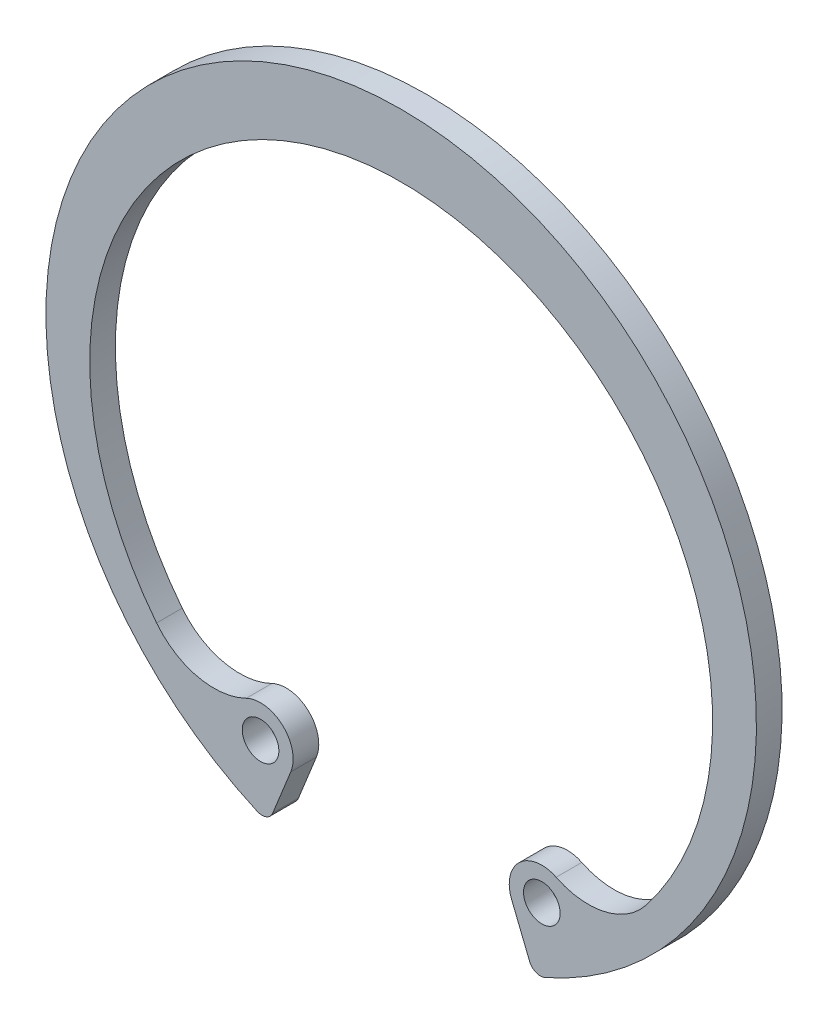
ISO-10303-21;
HEADER;
FILE_DESCRIPTION(('STEP AP214'),'2;1');
FILE_NAME('part.step','',(''),(''),'','','');
FILE_SCHEMA(('AUTOMOTIVE_DESIGN { 1 0 10303 214 1 1 1 1 }'));
ENDSEC;
DATA;
#1=APPLICATION_CONTEXT('core data for automotive mechanical design processes');
#2=APPLICATION_PROTOCOL_DEFINITION('international standard','automotive_design',2000,#1);
#3=PRODUCT_CONTEXT('',#1,'mechanical');
#4=PRODUCT('Part','Part','',(#3));
#5=PRODUCT_RELATED_PRODUCT_CATEGORY('part','',(#4));
#6=PRODUCT_DEFINITION_FORMATION('','',#4);
#7=PRODUCT_DEFINITION_CONTEXT('part definition',#1,'design');
#8=PRODUCT_DEFINITION('design','',#6,#7);
#9=PRODUCT_DEFINITION_SHAPE('','',#8);
#10=(LENGTH_UNIT() NAMED_UNIT(*) SI_UNIT(.MILLI.,.METRE.));
#11=(NAMED_UNIT(*) PLANE_ANGLE_UNIT() SI_UNIT($,.RADIAN.));
#12=(NAMED_UNIT(*) SI_UNIT($,.STERADIAN.) SOLID_ANGLE_UNIT());
#13=UNCERTAINTY_MEASURE_WITH_UNIT(LENGTH_MEASURE(1.E-05),#10,'distance_accuracy_value','');
#14=(GEOMETRIC_REPRESENTATION_CONTEXT(3) GLOBAL_UNCERTAINTY_ASSIGNED_CONTEXT((#13)) GLOBAL_UNIT_ASSIGNED_CONTEXT((#10,
#11,#12)) REPRESENTATION_CONTEXT('',''));
#15=CARTESIAN_POINT('',(0.,0.,0.));
#16=DIRECTION('',(0.,0.,1.));
#17=DIRECTION('',(1.,0.,0.));
#18=AXIS2_PLACEMENT_3D('',#15,#16,#17);
#19=CARTESIAN_POINT('',(0.,0.,-0.874999999999999));
#20=DIRECTION('',(0.,0.,1.));
#21=DIRECTION('',(1.,0.,0.));
#22=AXIS2_PLACEMENT_3D('',#19,#20,#21);
#23=CYLINDRICAL_SURFACE('',#22,24.25);
#24=CARTESIAN_POINT('',(0.,0.,0.875000000000001));
#25=DIRECTION('',(0.,0.,1.));
#26=DIRECTION('',(-1.,0.,0.));
#27=AXIS2_PLACEMENT_3D('',#24,#25,#26);
#28=CIRCLE('',#27,24.25);
#29=CARTESIAN_POINT('',(9.82443604998998,-22.1707680584065,0.875000000000001));
#30=VERTEX_POINT('',#29);
#31=CARTESIAN_POINT('',(-9.82443604998999,-22.1707680584065,0.875000000000001));
#32=VERTEX_POINT('',#31);
#33=EDGE_CURVE('E132',#30,#32,#28,.T.);
#34=ORIENTED_EDGE('',*,*,#33,.F.);
#35=DIRECTION('',(0.,0.,1.));
#36=VECTOR('',#35,1.);
#37=CARTESIAN_POINT('',(9.82443604998999,-22.1707680584065,-0.874999999999999));
#38=LINE('',#37,#36);
#39=CARTESIAN_POINT('',(9.82443604998998,-22.1707680584065,-0.874999999999999));
#40=VERTEX_POINT('',#39);
#41=EDGE_CURVE('E231',#30,#40,#38,.F.);
#42=ORIENTED_EDGE('',*,*,#41,.T.);
#43=CARTESIAN_POINT('',(0.,0.,-0.874999999999999));
#44=DIRECTION('',(0.,0.,1.));
#45=DIRECTION('',(-1.,0.,0.));
#46=AXIS2_PLACEMENT_3D('',#43,#44,#45);
#47=CIRCLE('',#46,24.25);
#48=CARTESIAN_POINT('',(-9.82443604998999,-22.1707680584065,-0.874999999999999));
#49=VERTEX_POINT('',#48);
#50=EDGE_CURVE('E177',#40,#49,#47,.T.);
#51=ORIENTED_EDGE('',*,*,#50,.T.);
#52=DIRECTION('',(0.,0.,1.));
#53=VECTOR('',#52,1.);
#54=CARTESIAN_POINT('',(-9.82443604998999,-22.1707680584065,-0.874999999999999));
#55=LINE('',#54,#53);
#56=EDGE_CURVE('E227',#49,#32,#55,.T.);
#57=ORIENTED_EDGE('',*,*,#56,.T.);
#58=EDGE_LOOP('',(#34,#42,#51,#57));
#59=FACE_BOUND('',#58,.T.);
#60=ADVANCED_FACE('F43',(#59),#23,.T.);
#61=CARTESIAN_POINT('',(7.53626964159346,-18.690362219315,-0.874999999999999));
#62=DIRECTION('',(-0.927444341621787,-0.373961218836565,0.));
#63=DIRECTION('',(0.373961218836565,-0.927444341621787,0.));
#64=AXIS2_PLACEMENT_3D('',#61,#62,#63);
#65=PLANE('',#64);
#66=DIRECTION('',(0.373961218836565,-0.927444341621787,0.));
#67=VECTOR('',#66,1.);
#68=CARTESIAN_POINT('',(7.53626964159346,-18.690362219315,-0.874999999999999));
#69=LINE('',#68,#67);
#70=CARTESIAN_POINT('',(7.53626964159346,-18.690362219315,-0.874999999999999));
#71=VERTEX_POINT('',#70);
#72=CARTESIAN_POINT('',(8.7667040681708,-21.7419071100287,-0.874999999999999));
#73=VERTEX_POINT('',#72);
#74=EDGE_CURVE('E143',#71,#73,#69,.T.);
#75=ORIENTED_EDGE('',*,*,#74,.T.);
#76=DIRECTION('',(0.,0.,1.));
#77=VECTOR('',#76,1.);
#78=CARTESIAN_POINT('',(8.7667040681708,-21.7419071100287,-0.874999999999999));
#79=LINE('',#78,#77);
#80=CARTESIAN_POINT('',(8.7667040681708,-21.7419071100287,0.875000000000001));
#81=VERTEX_POINT('',#80);
#82=EDGE_CURVE('E207',#73,#81,#79,.T.);
#83=ORIENTED_EDGE('',*,*,#82,.T.);
#84=DIRECTION('',(0.373961218836565,-0.927444341621787,0.));
#85=VECTOR('',#84,1.);
#86=CARTESIAN_POINT('',(7.53626964159346,-18.690362219315,0.875000000000001));
#87=LINE('',#86,#85);
#88=CARTESIAN_POINT('',(7.53626964159346,-18.690362219315,0.875000000000001));
#89=VERTEX_POINT('',#88);
#90=EDGE_CURVE('E166',#89,#81,#87,.T.);
#91=ORIENTED_EDGE('',*,*,#90,.F.);
#92=DIRECTION('',(0.,0.,1.));
#93=VECTOR('',#92,1.);
#94=CARTESIAN_POINT('',(7.53626964159346,-18.690362219315,-0.874999999999999));
#95=LINE('',#94,#93);
#96=EDGE_CURVE('E204',#71,#89,#95,.T.);
#97=ORIENTED_EDGE('',*,*,#96,.F.);
#98=EDGE_LOOP('',(#75,#83,#91,#97));
#99=FACE_BOUND('',#98,.T.);
#100=ADVANCED_FACE('F245',(#99),#65,.T.);
#101=CARTESIAN_POINT('',(9.59983330170194,-17.8582985074036,-0.874999999999999));
#102=DIRECTION('',(0.,0.,1.));
#103=DIRECTION('',(1.,0.,0.));
#104=AXIS2_PLACEMENT_3D('',#101,#102,#103);
#105=CYLINDRICAL_SURFACE('',#104,2.225);
#106=ORIENTED_EDGE('',*,*,#96,.T.);
#107=CARTESIAN_POINT('',(9.59983330170194,-17.8582985074036,0.875000000000001));
#108=DIRECTION('',(0.,0.,1.));
#109=DIRECTION('',(1.,0.,0.));
#110=AXIS2_PLACEMENT_3D('',#107,#108,#109);
#111=CIRCLE('',#110,2.225);
#112=CARTESIAN_POINT('',(10.5790722598928,-15.860370565069,0.875000000000001));
#113=VERTEX_POINT('',#112);
#114=EDGE_CURVE('E162',#113,#89,#111,.T.);
#115=ORIENTED_EDGE('',*,*,#114,.F.);
#116=DIRECTION('',(0.,0.,1.));
#117=VECTOR('',#116,1.);
#118=CARTESIAN_POINT('',(10.5790722598928,-15.860370565069,-0.874999999999999));
#119=LINE('',#118,#117);
#120=CARTESIAN_POINT('',(10.5790722598928,-15.860370565069,-0.874999999999999));
#121=VERTEX_POINT('',#120);
#122=EDGE_CURVE('E208',#121,#113,#119,.T.);
#123=ORIENTED_EDGE('',*,*,#122,.F.);
#124=CARTESIAN_POINT('',(9.59983330170194,-17.8582985074036,-0.874999999999999));
#125=DIRECTION('',(0.,0.,1.));
#126=DIRECTION('',(1.,0.,0.));
#127=AXIS2_PLACEMENT_3D('',#124,#125,#126);
#128=CIRCLE('',#127,2.225);
#129=EDGE_CURVE('E197',#121,#71,#128,.T.);
#130=ORIENTED_EDGE('',*,*,#129,.T.);
#131=EDGE_LOOP('',(#106,#115,#123,#130));
#132=FACE_BOUND('',#131,.T.);
#133=ADVANCED_FACE('F280',(#132),#105,.T.);
#134=CARTESIAN_POINT('',(12.7760927844927,-11.377819437722,-0.874999999999999));
#135=DIRECTION('',(0.,0.,1.));
#136=DIRECTION('',(1.,0.,0.));
#137=AXIS2_PLACEMENT_3D('',#134,#135,#136);
#138=CYLINDRICAL_SURFACE('',#137,4.99200999546205);
#139=ORIENTED_EDGE('',*,*,#122,.T.);
#140=CARTESIAN_POINT('',(12.7760927844927,-11.377819437722,0.875000000000001));
#141=DIRECTION('',(0.,0.,-1.));
#142=DIRECTION('',(-1.,0.,0.));
#143=AXIS2_PLACEMENT_3D('',#140,#141,#142);
#144=CIRCLE('',#143,4.99200999546205);
#145=CARTESIAN_POINT('',(16.6968412939928,-14.4677862530852,0.875000000000001));
#146=VERTEX_POINT('',#145);
#147=EDGE_CURVE('E158',#146,#113,#144,.T.);
#148=ORIENTED_EDGE('',*,*,#147,.F.);
#149=DIRECTION('',(0.,0.,1.));
#150=VECTOR('',#149,1.);
#151=CARTESIAN_POINT('',(16.6968412939928,-14.4677862530852,-0.874999999999999));
#152=LINE('',#151,#150);
#153=CARTESIAN_POINT('',(16.6968412939928,-14.4677862530852,-0.874999999999999));
#154=VERTEX_POINT('',#153);
#155=EDGE_CURVE('E211',#154,#146,#152,.T.);
#156=ORIENTED_EDGE('',*,*,#155,.F.);
#157=CARTESIAN_POINT('',(12.7760927844927,-11.377819437722,-0.874999999999999));
#158=DIRECTION('',(0.,0.,-1.));
#159=DIRECTION('',(-1.,0.,0.));
#160=AXIS2_PLACEMENT_3D('',#157,#158,#159);
#161=CIRCLE('',#160,4.99200999546205);
#162=EDGE_CURVE('E193',#154,#121,#161,.T.);
#163=ORIENTED_EDGE('',*,*,#162,.T.);
#164=EDGE_LOOP('',(#139,#148,#156,#163));
#165=FACE_BOUND('',#164,.T.);
#166=ADVANCED_FACE('F294',(#165),#138,.F.);
#167=CARTESIAN_POINT('',(0.,-1.30889952652993,-0.874999999999999));
#168=DIRECTION('',(0.,0.,1.));
#169=DIRECTION('',(1.,0.,0.));
#170=AXIS2_PLACEMENT_3D('',#167,#168,#169);
#171=CYLINDRICAL_SURFACE('',#170,21.2588995265299);
#172=ORIENTED_EDGE('',*,*,#155,.T.);
#173=CARTESIAN_POINT('',(0.,-1.30889952652993,0.875000000000001));
#174=DIRECTION('',(0.,0.,-1.));
#175=DIRECTION('',(-1.,0.,0.));
#176=AXIS2_PLACEMENT_3D('',#173,#174,#175);
#177=CIRCLE('',#176,21.2588995265299);
#178=CARTESIAN_POINT('',(-16.6968412939928,-14.4677862530852,0.875000000000001));
#179=VERTEX_POINT('',#178);
#180=EDGE_CURVE('E151',#179,#146,#177,.T.);
#181=ORIENTED_EDGE('',*,*,#180,.F.);
#182=DIRECTION('',(0.,0.,1.));
#183=VECTOR('',#182,1.);
#184=CARTESIAN_POINT('',(-16.6968412939928,-14.4677862530852,-0.874999999999999));
#185=LINE('',#184,#183);
#186=CARTESIAN_POINT('',(-16.6968412939928,-14.4677862530852,-0.874999999999999));
#187=VERTEX_POINT('',#186);
#188=EDGE_CURVE('E214',#187,#179,#185,.T.);
#189=ORIENTED_EDGE('',*,*,#188,.F.);
#190=CARTESIAN_POINT('',(0.,-1.30889952652993,-0.874999999999999));
#191=DIRECTION('',(0.,0.,-1.));
#192=DIRECTION('',(-1.,0.,0.));
#193=AXIS2_PLACEMENT_3D('',#190,#191,#192);
#194=CIRCLE('',#193,21.2588995265299);
#195=EDGE_CURVE('E189',#187,#154,#194,.T.);
#196=ORIENTED_EDGE('',*,*,#195,.T.);
#197=EDGE_LOOP('',(#172,#181,#189,#196));
#198=FACE_BOUND('',#197,.T.);
#199=ADVANCED_FACE('F290',(#198),#171,.F.);
#200=CARTESIAN_POINT('',(-12.7760927844927,-11.377819437722,-0.874999999999999));
#201=DIRECTION('',(0.,0.,1.));
#202=DIRECTION('',(1.,0.,0.));
#203=AXIS2_PLACEMENT_3D('',#200,#201,#202);
#204=CYLINDRICAL_SURFACE('',#203,4.99200999546205);
#205=ORIENTED_EDGE('',*,*,#188,.T.);
#206=CARTESIAN_POINT('',(-12.7760927844927,-11.377819437722,0.875000000000001));
#207=DIRECTION('',(0.,0.,-1.));
#208=DIRECTION('',(1.,0.,0.));
#209=AXIS2_PLACEMENT_3D('',#206,#207,#208);
#210=CIRCLE('',#209,4.99200999546205);
#211=CARTESIAN_POINT('',(-10.5790722598928,-15.860370565069,0.875000000000001));
#212=VERTEX_POINT('',#211);
#213=EDGE_CURVE('E147',#212,#179,#210,.T.);
#214=ORIENTED_EDGE('',*,*,#213,.F.);
#215=DIRECTION('',(0.,0.,1.));
#216=VECTOR('',#215,1.);
#217=CARTESIAN_POINT('',(-10.5790722598928,-15.860370565069,-0.874999999999999));
#218=LINE('',#217,#216);
#219=CARTESIAN_POINT('',(-10.5790722598928,-15.860370565069,-0.874999999999999));
#220=VERTEX_POINT('',#219);
#221=EDGE_CURVE('E142',#220,#212,#218,.T.);
#222=ORIENTED_EDGE('',*,*,#221,.F.);
#223=CARTESIAN_POINT('',(-12.7760927844927,-11.377819437722,-0.874999999999999));
#224=DIRECTION('',(0.,0.,-1.));
#225=DIRECTION('',(1.,0.,0.));
#226=AXIS2_PLACEMENT_3D('',#223,#224,#225);
#227=CIRCLE('',#226,4.99200999546205);
#228=EDGE_CURVE('E185',#220,#187,#227,.T.);
#229=ORIENTED_EDGE('',*,*,#228,.T.);
#230=EDGE_LOOP('',(#205,#214,#222,#229));
#231=FACE_BOUND('',#230,.T.);
#232=ADVANCED_FACE('F287',(#231),#204,.F.);
#233=CARTESIAN_POINT('',(-9.59983330170194,-17.8582985074036,-0.874999999999999));
#234=DIRECTION('',(0.,0.,1.));
#235=DIRECTION('',(1.,0.,0.));
#236=AXIS2_PLACEMENT_3D('',#233,#234,#235);
#237=CYLINDRICAL_SURFACE('',#236,2.225);
#238=ORIENTED_EDGE('',*,*,#221,.T.);
#239=CARTESIAN_POINT('',(-9.59983330170194,-17.8582985074036,0.875000000000001));
#240=DIRECTION('',(0.,0.,1.));
#241=DIRECTION('',(-1.,0.,0.));
#242=AXIS2_PLACEMENT_3D('',#239,#240,#241);
#243=CIRCLE('',#242,2.225);
#244=CARTESIAN_POINT('',(-7.53626964159346,-18.690362219315,0.875000000000001));
#245=VERTEX_POINT('',#244);
#246=EDGE_CURVE('E127',#245,#212,#243,.T.);
#247=ORIENTED_EDGE('',*,*,#246,.F.);
#248=DIRECTION('',(0.,0.,1.));
#249=VECTOR('',#248,1.);
#250=CARTESIAN_POINT('',(-7.53626964159346,-18.690362219315,-0.874999999999999));
#251=LINE('',#250,#249);
#252=CARTESIAN_POINT('',(-7.53626964159346,-18.690362219315,-0.874999999999999));
#253=VERTEX_POINT('',#252);
#254=EDGE_CURVE('E135',#253,#245,#251,.T.);
#255=ORIENTED_EDGE('',*,*,#254,.F.);
#256=CARTESIAN_POINT('',(-9.59983330170194,-17.8582985074036,-0.874999999999999));
#257=DIRECTION('',(0.,0.,1.));
#258=DIRECTION('',(-1.,0.,0.));
#259=AXIS2_PLACEMENT_3D('',#256,#257,#258);
#260=CIRCLE('',#259,2.225);
#261=EDGE_CURVE('E182',#253,#220,#260,.T.);
#262=ORIENTED_EDGE('',*,*,#261,.T.);
#263=EDGE_LOOP('',(#238,#247,#255,#262));
#264=FACE_BOUND('',#263,.T.);
#265=ADVANCED_FACE('F145',(#264),#237,.T.);
#266=CARTESIAN_POINT('',(-7.53626964159346,-18.690362219315,-0.874999999999999));
#267=DIRECTION('',(0.927444341621787,-0.373961218836565,0.));
#268=DIRECTION('',(0.373961218836565,0.927444341621787,0.));
#269=AXIS2_PLACEMENT_3D('',#266,#267,#268);
#270=PLANE('',#269);
#271=DIRECTION('',(0.373961218836565,0.927444341621787,0.));
#272=VECTOR('',#271,1.);
#273=CARTESIAN_POINT('',(-7.53626964159346,-18.690362219315,0.875000000000001));
#274=LINE('',#273,#272);
#275=CARTESIAN_POINT('',(-8.7667040681708,-21.7419071100287,0.875000000000001));
#276=VERTEX_POINT('',#275);
#277=EDGE_CURVE('E120',#276,#245,#274,.T.);
#278=ORIENTED_EDGE('',*,*,#277,.F.);
#279=DIRECTION('',(0.,0.,1.));
#280=VECTOR('',#279,1.);
#281=CARTESIAN_POINT('',(-8.7667040681708,-21.7419071100287,-0.874999999999999));
#282=LINE('',#281,#280);
#283=CARTESIAN_POINT('',(-8.7667040681708,-21.7419071100287,-0.874999999999999));
#284=VERTEX_POINT('',#283);
#285=EDGE_CURVE('E11',#276,#284,#282,.F.);
#286=ORIENTED_EDGE('',*,*,#285,.T.);
#287=DIRECTION('',(0.373961218836565,0.927444341621787,0.));
#288=VECTOR('',#287,1.);
#289=CARTESIAN_POINT('',(-7.53626964159346,-18.690362219315,-0.874999999999999));
#290=LINE('',#289,#288);
#291=EDGE_CURVE('E137',#284,#253,#290,.T.);
#292=ORIENTED_EDGE('',*,*,#291,.T.);
#293=ORIENTED_EDGE('',*,*,#254,.T.);
#294=EDGE_LOOP('',(#278,#286,#292,#293));
#295=FACE_BOUND('',#294,.T.);
#296=ADVANCED_FACE('F136',(#295),#270,.T.);
#297=CARTESIAN_POINT('',(0.,0.,-0.874999999999999));
#298=DIRECTION('',(0.,0.,-1.));
#299=DIRECTION('',(-1.,0.,0.));
#300=AXIS2_PLACEMENT_3D('',#297,#298,#299);
#301=PLANE('',#300);
#302=CARTESIAN_POINT('',(9.59983330170194,-17.8582985074036,-0.874999999999999));
#303=DIRECTION('',(0.,0.,1.));
#304=DIRECTION('',(-1.,0.,0.));
#305=AXIS2_PLACEMENT_3D('',#302,#303,#304);
#306=CIRCLE('',#305,1.25);
#307=CARTESIAN_POINT('',(8.34983330170194,-17.8582985074036,-0.874999999999999));
#308=VERTEX_POINT('',#307);
#309=EDGE_CURVE('E169',#308,#308,#306,.T.);
#310=ORIENTED_EDGE('',*,*,#309,.T.);
#311=EDGE_LOOP('',(#310));
#312=FACE_BOUND('',#311,.T.);
#313=CARTESIAN_POINT('',(-9.59983330170194,-17.8582985074036,-0.874999999999999));
#314=DIRECTION('',(0.,0.,1.));
#315=DIRECTION('',(1.,0.,0.));
#316=AXIS2_PLACEMENT_3D('',#313,#314,#315);
#317=CIRCLE('',#316,1.25);
#318=CARTESIAN_POINT('',(-8.34983330170194,-17.8582985074036,-0.874999999999999));
#319=VERTEX_POINT('',#318);
#320=EDGE_CURVE('E173',#319,#319,#317,.T.);
#321=ORIENTED_EDGE('',*,*,#320,.T.);
#322=EDGE_LOOP('',(#321));
#323=FACE_BOUND('',#322,.T.);
#324=ORIENTED_EDGE('',*,*,#50,.F.);
#325=CARTESIAN_POINT('',(9.5028630143331,-21.4450753925772,-0.874999999999999));
#326=DIRECTION('',(0.,0.,-1.));
#327=DIRECTION('',(-1.,0.,0.));
#328=AXIS2_PLACEMENT_3D('',#325,#326,#327);
#329=CIRCLE('',#328,0.79375);
#330=EDGE_CURVE('E52',#40,#73,#329,.T.);
#331=ORIENTED_EDGE('',*,*,#330,.T.);
#332=ORIENTED_EDGE('',*,*,#74,.F.);
#333=ORIENTED_EDGE('',*,*,#129,.F.);
#334=ORIENTED_EDGE('',*,*,#162,.F.);
#335=ORIENTED_EDGE('',*,*,#195,.F.);
#336=ORIENTED_EDGE('',*,*,#228,.F.);
#337=ORIENTED_EDGE('',*,*,#261,.F.);
#338=ORIENTED_EDGE('',*,*,#291,.F.);
#339=CARTESIAN_POINT('',(-9.5028630143331,-21.4450753925772,-0.874999999999999));
#340=DIRECTION('',(0.,0.,-1.));
#341=DIRECTION('',(-1.,0.,0.));
#342=AXIS2_PLACEMENT_3D('',#339,#340,#341);
#343=CIRCLE('',#342,0.79375);
#344=EDGE_CURVE('E64',#284,#49,#343,.T.);
#345=ORIENTED_EDGE('',*,*,#344,.T.);
#346=EDGE_LOOP('',(#324,#331,#332,#333,#334,#335,#336,#337,#338,#345));
#347=FACE_BOUND('',#346,.T.);
#348=ADVANCED_FACE('F239',(#312,#323,#347),#301,.T.);
#349=CARTESIAN_POINT('',(-9.59983330170194,-17.8582985074036,-0.874999999999999));
#350=DIRECTION('',(0.,0.,1.));
#351=DIRECTION('',(1.,0.,0.));
#352=AXIS2_PLACEMENT_3D('',#349,#350,#351);
#353=CYLINDRICAL_SURFACE('',#352,1.25);
#354=ORIENTED_EDGE('',*,*,#320,.F.);
#355=EDGE_LOOP('',(#354));
#356=FACE_BOUND('',#355,.T.);
#357=CARTESIAN_POINT('',(-9.59983330170194,-17.8582985074036,0.875000000000001));
#358=DIRECTION('',(0.,0.,1.));
#359=DIRECTION('',(1.,0.,0.));
#360=AXIS2_PLACEMENT_3D('',#357,#358,#359);
#361=CIRCLE('',#360,1.25);
#362=CARTESIAN_POINT('',(-8.34983330170194,-17.8582985074036,0.875000000000001));
#363=VERTEX_POINT('',#362);
#364=EDGE_CURVE('E252',#363,#363,#361,.T.);
#365=ORIENTED_EDGE('',*,*,#364,.T.);
#366=EDGE_LOOP('',(#365));
#367=FACE_BOUND('',#366,.T.);
#368=ADVANCED_FACE('F272',(#356,#367),#353,.F.);
#369=CARTESIAN_POINT('',(9.59983330170194,-17.8582985074036,-0.874999999999999));
#370=DIRECTION('',(0.,0.,1.));
#371=DIRECTION('',(1.,0.,0.));
#372=AXIS2_PLACEMENT_3D('',#369,#370,#371);
#373=CYLINDRICAL_SURFACE('',#372,1.25);
#374=ORIENTED_EDGE('',*,*,#309,.F.);
#375=EDGE_LOOP('',(#374));
#376=FACE_BOUND('',#375,.T.);
#377=CARTESIAN_POINT('',(9.59983330170194,-17.8582985074036,0.875000000000001));
#378=DIRECTION('',(0.,0.,1.));
#379=DIRECTION('',(-1.,0.,0.));
#380=AXIS2_PLACEMENT_3D('',#377,#378,#379);
#381=CIRCLE('',#380,1.25);
#382=CARTESIAN_POINT('',(8.34983330170194,-17.8582985074036,0.875000000000001));
#383=VERTEX_POINT('',#382);
#384=EDGE_CURVE('E256',#383,#383,#381,.T.);
#385=ORIENTED_EDGE('',*,*,#384,.T.);
#386=EDGE_LOOP('',(#385));
#387=FACE_BOUND('',#386,.T.);
#388=ADVANCED_FACE('F264',(#376,#387),#373,.F.);
#389=CARTESIAN_POINT('',(0.,0.,0.875000000000001));
#390=DIRECTION('',(0.,0.,-1.));
#391=DIRECTION('',(-1.,0.,0.));
#392=AXIS2_PLACEMENT_3D('',#389,#390,#391);
#393=PLANE('',#392);
#394=ORIENTED_EDGE('',*,*,#90,.T.);
#395=CARTESIAN_POINT('',(9.5028630143331,-21.4450753925772,0.875000000000001));
#396=DIRECTION('',(0.,0.,-1.));
#397=DIRECTION('',(-1.,0.,0.));
#398=AXIS2_PLACEMENT_3D('',#395,#396,#397);
#399=CIRCLE('',#398,0.79375);
#400=EDGE_CURVE('E224',#81,#30,#399,.F.);
#401=ORIENTED_EDGE('',*,*,#400,.T.);
#402=ORIENTED_EDGE('',*,*,#33,.T.);
#403=CARTESIAN_POINT('',(-9.5028630143331,-21.4450753925772,0.875000000000001));
#404=DIRECTION('',(0.,0.,-1.));
#405=DIRECTION('',(-1.,0.,0.));
#406=AXIS2_PLACEMENT_3D('',#403,#404,#405);
#407=CIRCLE('',#406,0.79375);
#408=EDGE_CURVE('E130',#32,#276,#407,.F.);
#409=ORIENTED_EDGE('',*,*,#408,.T.);
#410=ORIENTED_EDGE('',*,*,#277,.T.);
#411=ORIENTED_EDGE('',*,*,#246,.T.);
#412=ORIENTED_EDGE('',*,*,#213,.T.);
#413=ORIENTED_EDGE('',*,*,#180,.T.);
#414=ORIENTED_EDGE('',*,*,#147,.T.);
#415=ORIENTED_EDGE('',*,*,#114,.T.);
#416=EDGE_LOOP('',(#394,#401,#402,#409,#410,#411,#412,#413,#414,#415));
#417=FACE_BOUND('',#416,.T.);
#418=ORIENTED_EDGE('',*,*,#364,.F.);
#419=EDGE_LOOP('',(#418));
#420=FACE_BOUND('',#419,.T.);
#421=ORIENTED_EDGE('',*,*,#384,.F.);
#422=EDGE_LOOP('',(#421));
#423=FACE_BOUND('',#422,.T.);
#424=ADVANCED_FACE('F123',(#417,#420,#423),#393,.F.);
#425=CARTESIAN_POINT('',(9.5028630143331,-21.4450753925772,-0.874999999999999));
#426=DIRECTION('',(0.,0.,1.));
#427=DIRECTION('',(1.,0.,0.));
#428=AXIS2_PLACEMENT_3D('',#425,#426,#427);
#429=CYLINDRICAL_SURFACE('',#428,0.79375);
#430=ORIENTED_EDGE('',*,*,#330,.F.);
#431=ORIENTED_EDGE('',*,*,#41,.F.);
#432=ORIENTED_EDGE('',*,*,#400,.F.);
#433=ORIENTED_EDGE('',*,*,#82,.F.);
#434=EDGE_LOOP('',(#430,#431,#432,#433));
#435=FACE_BOUND('',#434,.T.);
#436=ADVANCED_FACE('F247',(#435),#429,.T.);
#437=CARTESIAN_POINT('',(-9.5028630143331,-21.4450753925772,-0.874999999999999));
#438=DIRECTION('',(0.,0.,1.));
#439=DIRECTION('',(1.,0.,0.));
#440=AXIS2_PLACEMENT_3D('',#437,#438,#439);
#441=CYLINDRICAL_SURFACE('',#440,0.79375);
#442=ORIENTED_EDGE('',*,*,#344,.F.);
#443=ORIENTED_EDGE('',*,*,#285,.F.);
#444=ORIENTED_EDGE('',*,*,#408,.F.);
#445=ORIENTED_EDGE('',*,*,#56,.F.);
#446=EDGE_LOOP('',(#442,#443,#444,#445));
#447=FACE_BOUND('',#446,.T.);
#448=ADVANCED_FACE('F45',(#447),#441,.T.);
#449=CLOSED_SHELL('',(#60,#100,#133,#166,#199,#232,#265,#296,#348,#368,#388,#424,#436,#448));
#450=MANIFOLD_SOLID_BREP('B2',#449);
#451=ADVANCED_BREP_SHAPE_REPRESENTATION('',(#18,#450),#14);
#452=SHAPE_DEFINITION_REPRESENTATION(#9,#451);
ENDSEC;
END-ISO-10303-21;
